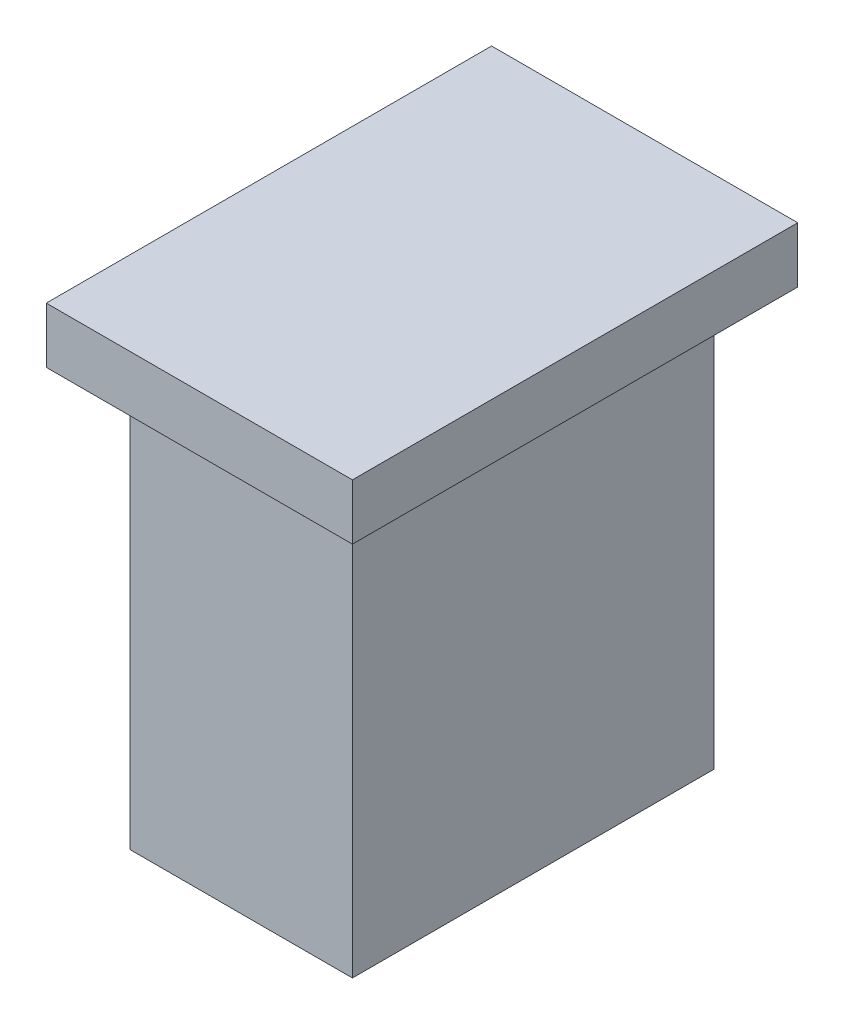
ISO-10303-21;
HEADER;
FILE_DESCRIPTION(('STEP AP214'),'2;1');
FILE_NAME('part.step','',(''),(''),'','','');
FILE_SCHEMA(('AUTOMOTIVE_DESIGN { 1 0 10303 214 1 1 1 1 }'));
ENDSEC;
DATA;
#1=APPLICATION_CONTEXT('core data for automotive mechanical design processes');
#2=APPLICATION_PROTOCOL_DEFINITION('international standard','automotive_design',2000,#1);
#3=PRODUCT_CONTEXT('',#1,'mechanical');
#4=PRODUCT('Part','Part','',(#3));
#5=PRODUCT_RELATED_PRODUCT_CATEGORY('part','',(#4));
#6=PRODUCT_DEFINITION_FORMATION('','',#4);
#7=PRODUCT_DEFINITION_CONTEXT('part definition',#1,'design');
#8=PRODUCT_DEFINITION('design','',#6,#7);
#9=PRODUCT_DEFINITION_SHAPE('','',#8);
#10=(LENGTH_UNIT() NAMED_UNIT(*) SI_UNIT(.MILLI.,.METRE.));
#11=(NAMED_UNIT(*) PLANE_ANGLE_UNIT() SI_UNIT($,.RADIAN.));
#12=(NAMED_UNIT(*) SI_UNIT($,.STERADIAN.) SOLID_ANGLE_UNIT());
#13=UNCERTAINTY_MEASURE_WITH_UNIT(LENGTH_MEASURE(1.E-05),#10,'distance_accuracy_value','');
#14=(GEOMETRIC_REPRESENTATION_CONTEXT(3) GLOBAL_UNCERTAINTY_ASSIGNED_CONTEXT((#13)) GLOBAL_UNIT_ASSIGNED_CONTEXT((#10,
#11,#12)) REPRESENTATION_CONTEXT('',''));
#15=CARTESIAN_POINT('',(0.,0.,0.));
#16=DIRECTION('',(0.,0.,1.));
#17=DIRECTION('',(1.,0.,0.));
#18=AXIS2_PLACEMENT_3D('',#15,#16,#17);
#19=CARTESIAN_POINT('',(4.,15.,-6.5));
#20=DIRECTION('',(-1.,0.,0.));
#21=DIRECTION('',(0.,0.,1.));
#22=AXIS2_PLACEMENT_3D('',#19,#20,#21);
#23=PLANE('',#22);
#24=DIRECTION('',(0.,0.,-1.));
#25=VECTOR('',#24,1.);
#26=CARTESIAN_POINT('',(4.,0.,-6.5));
#27=LINE('',#26,#25);
#28=CARTESIAN_POINT('',(4.,0.,6.5));
#29=VERTEX_POINT('',#28);
#30=CARTESIAN_POINT('',(4.,0.,-6.5));
#31=VERTEX_POINT('',#30);
#32=EDGE_CURVE('E147',#29,#31,#27,.T.);
#33=ORIENTED_EDGE('',*,*,#32,.T.);
#34=DIRECTION('',(0.,-1.,0.));
#35=VECTOR('',#34,1.);
#36=CARTESIAN_POINT('',(4.,15.,-6.5));
#37=LINE('',#36,#35);
#38=CARTESIAN_POINT('',(4.,15.,-6.5));
#39=VERTEX_POINT('',#38);
#40=EDGE_CURVE('E11',#39,#31,#37,.T.);
#41=ORIENTED_EDGE('',*,*,#40,.F.);
#42=DIRECTION('',(0.,0.,-1.));
#43=VECTOR('',#42,1.);
#44=CARTESIAN_POINT('',(4.,15.,-6.5));
#45=LINE('',#44,#43);
#46=CARTESIAN_POINT('',(4.,15.,6.5));
#47=VERTEX_POINT('',#46);
#48=EDGE_CURVE('E158',#47,#39,#45,.T.);
#49=ORIENTED_EDGE('',*,*,#48,.F.);
#50=DIRECTION('',(0.,-1.,0.));
#51=VECTOR('',#50,1.);
#52=CARTESIAN_POINT('',(4.,15.,6.5));
#53=LINE('',#52,#51);
#54=EDGE_CURVE('E171',#47,#29,#53,.T.);
#55=ORIENTED_EDGE('',*,*,#54,.T.);
#56=EDGE_LOOP('',(#33,#41,#49,#55));
#57=FACE_BOUND('',#56,.T.);
#58=ADVANCED_FACE('F45',(#57),#23,.F.);
#59=CARTESIAN_POINT('',(-4.,15.,-6.5));
#60=DIRECTION('',(0.,0.,1.));
#61=DIRECTION('',(1.,0.,0.));
#62=AXIS2_PLACEMENT_3D('',#59,#60,#61);
#63=PLANE('',#62);
#64=DIRECTION('',(-1.,0.,0.));
#65=VECTOR('',#64,1.);
#66=CARTESIAN_POINT('',(-4.,0.,-6.5));
#67=LINE('',#66,#65);
#68=CARTESIAN_POINT('',(-4.,0.,-6.5));
#69=VERTEX_POINT('',#68);
#70=EDGE_CURVE('E152',#31,#69,#67,.T.);
#71=ORIENTED_EDGE('',*,*,#70,.T.);
#72=DIRECTION('',(0.,-1.,0.));
#73=VECTOR('',#72,1.);
#74=CARTESIAN_POINT('',(-4.,15.,-6.5));
#75=LINE('',#74,#73);
#76=CARTESIAN_POINT('',(-4.,15.,-6.5));
#77=VERTEX_POINT('',#76);
#78=EDGE_CURVE('E54',#77,#69,#75,.T.);
#79=ORIENTED_EDGE('',*,*,#78,.F.);
#80=DIRECTION('',(-1.,0.,0.));
#81=VECTOR('',#80,1.);
#82=CARTESIAN_POINT('',(-4.,15.,-6.5));
#83=LINE('',#82,#81);
#84=EDGE_CURVE('E88',#39,#77,#83,.T.);
#85=ORIENTED_EDGE('',*,*,#84,.F.);
#86=ORIENTED_EDGE('',*,*,#40,.T.);
#87=EDGE_LOOP('',(#71,#79,#85,#86));
#88=FACE_BOUND('',#87,.T.);
#89=ADVANCED_FACE('F204',(#88),#63,.F.);
#90=CARTESIAN_POINT('',(-4.,15.,-6.5));
#91=DIRECTION('',(1.,0.,0.));
#92=DIRECTION('',(0.,0.,-1.));
#93=AXIS2_PLACEMENT_3D('',#90,#91,#92);
#94=PLANE('',#93);
#95=DIRECTION('',(0.,0.,1.));
#96=VECTOR('',#95,1.);
#97=CARTESIAN_POINT('',(-4.,0.,-6.5));
#98=LINE('',#97,#96);
#99=CARTESIAN_POINT('',(-4.,0.,6.5));
#100=VERTEX_POINT('',#99);
#101=EDGE_CURVE('E78',#69,#100,#98,.T.);
#102=ORIENTED_EDGE('',*,*,#101,.T.);
#103=DIRECTION('',(0.,-1.,0.));
#104=VECTOR('',#103,1.);
#105=CARTESIAN_POINT('',(-4.,15.,6.5));
#106=LINE('',#105,#104);
#107=CARTESIAN_POINT('',(-4.,15.,6.5));
#108=VERTEX_POINT('',#107);
#109=EDGE_CURVE('E62',#108,#100,#106,.T.);
#110=ORIENTED_EDGE('',*,*,#109,.F.);
#111=DIRECTION('',(0.,0.,1.));
#112=VECTOR('',#111,1.);
#113=CARTESIAN_POINT('',(-4.,15.,-6.5));
#114=LINE('',#113,#112);
#115=EDGE_CURVE('E164',#77,#108,#114,.T.);
#116=ORIENTED_EDGE('',*,*,#115,.F.);
#117=ORIENTED_EDGE('',*,*,#78,.T.);
#118=EDGE_LOOP('',(#102,#110,#116,#117));
#119=FACE_BOUND('',#118,.T.);
#120=ADVANCED_FACE('F183',(#119),#94,.F.);
#121=CARTESIAN_POINT('',(-4.,15.,6.5));
#122=DIRECTION('',(0.,0.,-1.));
#123=DIRECTION('',(-1.,0.,0.));
#124=AXIS2_PLACEMENT_3D('',#121,#122,#123);
#125=PLANE('',#124);
#126=DIRECTION('',(1.,0.,0.));
#127=VECTOR('',#126,1.);
#128=CARTESIAN_POINT('',(-4.,0.,6.5));
#129=LINE('',#128,#127);
#130=EDGE_CURVE('E83',#100,#29,#129,.T.);
#131=ORIENTED_EDGE('',*,*,#130,.T.);
#132=ORIENTED_EDGE('',*,*,#54,.F.);
#133=DIRECTION('',(1.,0.,0.));
#134=VECTOR('',#133,1.);
#135=CARTESIAN_POINT('',(-4.,15.,6.5));
#136=LINE('',#135,#134);
#137=EDGE_CURVE('E168',#108,#47,#136,.T.);
#138=ORIENTED_EDGE('',*,*,#137,.F.);
#139=ORIENTED_EDGE('',*,*,#109,.T.);
#140=EDGE_LOOP('',(#131,#132,#138,#139));
#141=FACE_BOUND('',#140,.T.);
#142=ADVANCED_FACE('F188',(#141),#125,.F.);
#143=CARTESIAN_POINT('',(0.,0.,0.));
#144=DIRECTION('',(0.,1.,0.));
#145=DIRECTION('',(0.,0.,1.));
#146=AXIS2_PLACEMENT_3D('',#143,#144,#145);
#147=PLANE('',#146);
#148=ORIENTED_EDGE('',*,*,#32,.F.);
#149=ORIENTED_EDGE('',*,*,#130,.F.);
#150=ORIENTED_EDGE('',*,*,#101,.F.);
#151=ORIENTED_EDGE('',*,*,#70,.F.);
#152=EDGE_LOOP('',(#148,#149,#150,#151));
#153=FACE_BOUND('',#152,.T.);
#154=ADVANCED_FACE('F186',(#153),#147,.F.);
#155=CARTESIAN_POINT('',(0.,15.,0.));
#156=DIRECTION('',(0.,1.,0.));
#157=DIRECTION('',(0.,0.,1.));
#158=AXIS2_PLACEMENT_3D('',#155,#156,#157);
#159=PLANE('',#158);
#160=DIRECTION('',(0.,0.,-1.));
#161=VECTOR('',#160,1.);
#162=CARTESIAN_POINT('',(5.5,15.,-8.));
#163=LINE('',#162,#161);
#164=CARTESIAN_POINT('',(5.5,15.,8.));
#165=VERTEX_POINT('',#164);
#166=CARTESIAN_POINT('',(5.5,15.,-8.));
#167=VERTEX_POINT('',#166);
#168=EDGE_CURVE('E145',#165,#167,#163,.T.);
#169=ORIENTED_EDGE('',*,*,#168,.F.);
#170=DIRECTION('',(1.,0.,0.));
#171=VECTOR('',#170,1.);
#172=CARTESIAN_POINT('',(-5.5,15.,8.));
#173=LINE('',#172,#171);
#174=CARTESIAN_POINT('',(-5.5,15.,8.));
#175=VERTEX_POINT('',#174);
#176=EDGE_CURVE('E141',#175,#165,#173,.T.);
#177=ORIENTED_EDGE('',*,*,#176,.F.);
#178=DIRECTION('',(0.,0.,1.));
#179=VECTOR('',#178,1.);
#180=CARTESIAN_POINT('',(-5.5,15.,-8.));
#181=LINE('',#180,#179);
#182=CARTESIAN_POINT('',(-5.5,15.,-8.));
#183=VERTEX_POINT('',#182);
#184=EDGE_CURVE('E231',#183,#175,#181,.T.);
#185=ORIENTED_EDGE('',*,*,#184,.F.);
#186=DIRECTION('',(-1.,0.,0.));
#187=VECTOR('',#186,1.);
#188=CARTESIAN_POINT('',(-5.5,15.,-8.));
#189=LINE('',#188,#187);
#190=EDGE_CURVE('E235',#167,#183,#189,.T.);
#191=ORIENTED_EDGE('',*,*,#190,.F.);
#192=EDGE_LOOP('',(#169,#177,#185,#191));
#193=FACE_BOUND('',#192,.T.);
#194=ORIENTED_EDGE('',*,*,#137,.T.);
#195=ORIENTED_EDGE('',*,*,#48,.T.);
#196=ORIENTED_EDGE('',*,*,#84,.T.);
#197=ORIENTED_EDGE('',*,*,#115,.T.);
#198=EDGE_LOOP('',(#194,#195,#196,#197));
#199=FACE_BOUND('',#198,.T.);
#200=ADVANCED_FACE('F190',(#193,#199),#159,.F.);
#201=CARTESIAN_POINT('',(5.5,17.,-8.));
#202=DIRECTION('',(-1.,0.,0.));
#203=DIRECTION('',(0.,0.,1.));
#204=AXIS2_PLACEMENT_3D('',#201,#202,#203);
#205=PLANE('',#204);
#206=ORIENTED_EDGE('',*,*,#168,.T.);
#207=DIRECTION('',(0.,-1.,0.));
#208=VECTOR('',#207,1.);
#209=CARTESIAN_POINT('',(5.5,17.,-8.));
#210=LINE('',#209,#208);
#211=CARTESIAN_POINT('',(5.5,17.,-8.));
#212=VERTEX_POINT('',#211);
#213=EDGE_CURVE('E123',#212,#167,#210,.T.);
#214=ORIENTED_EDGE('',*,*,#213,.F.);
#215=DIRECTION('',(0.,0.,-1.));
#216=VECTOR('',#215,1.);
#217=CARTESIAN_POINT('',(5.5,17.,-8.));
#218=LINE('',#217,#216);
#219=CARTESIAN_POINT('',(5.5,17.,8.));
#220=VERTEX_POINT('',#219);
#221=EDGE_CURVE('E131',#220,#212,#218,.T.);
#222=ORIENTED_EDGE('',*,*,#221,.F.);
#223=DIRECTION('',(0.,-1.,0.));
#224=VECTOR('',#223,1.);
#225=CARTESIAN_POINT('',(5.5,17.,8.));
#226=LINE('',#225,#224);
#227=EDGE_CURVE('E227',#220,#165,#226,.T.);
#228=ORIENTED_EDGE('',*,*,#227,.T.);
#229=EDGE_LOOP('',(#206,#214,#222,#228));
#230=FACE_BOUND('',#229,.T.);
#231=ADVANCED_FACE('F143',(#230),#205,.F.);
#232=CARTESIAN_POINT('',(-5.5,17.,-8.));
#233=DIRECTION('',(0.,0.,1.));
#234=DIRECTION('',(1.,0.,0.));
#235=AXIS2_PLACEMENT_3D('',#232,#233,#234);
#236=PLANE('',#235);
#237=ORIENTED_EDGE('',*,*,#190,.T.);
#238=DIRECTION('',(0.,-1.,0.));
#239=VECTOR('',#238,1.);
#240=CARTESIAN_POINT('',(-5.5,17.,-8.));
#241=LINE('',#240,#239);
#242=CARTESIAN_POINT('',(-5.5,17.,-8.));
#243=VERTEX_POINT('',#242);
#244=EDGE_CURVE('E126',#243,#183,#241,.T.);
#245=ORIENTED_EDGE('',*,*,#244,.F.);
#246=DIRECTION('',(-1.,0.,0.));
#247=VECTOR('',#246,1.);
#248=CARTESIAN_POINT('',(-5.5,17.,-8.));
#249=LINE('',#248,#247);
#250=EDGE_CURVE('E119',#212,#243,#249,.T.);
#251=ORIENTED_EDGE('',*,*,#250,.F.);
#252=ORIENTED_EDGE('',*,*,#213,.T.);
#253=EDGE_LOOP('',(#237,#245,#251,#252));
#254=FACE_BOUND('',#253,.T.);
#255=ADVANCED_FACE('F121',(#254),#236,.F.);
#256=CARTESIAN_POINT('',(-5.5,17.,-8.));
#257=DIRECTION('',(1.,0.,0.));
#258=DIRECTION('',(0.,0.,-1.));
#259=AXIS2_PLACEMENT_3D('',#256,#257,#258);
#260=PLANE('',#259);
#261=ORIENTED_EDGE('',*,*,#184,.T.);
#262=DIRECTION('',(0.,-1.,0.));
#263=VECTOR('',#262,1.);
#264=CARTESIAN_POINT('',(-5.5,17.,8.));
#265=LINE('',#264,#263);
#266=CARTESIAN_POINT('',(-5.5,17.,8.));
#267=VERTEX_POINT('',#266);
#268=EDGE_CURVE('E154',#267,#175,#265,.T.);
#269=ORIENTED_EDGE('',*,*,#268,.F.);
#270=DIRECTION('',(0.,0.,1.));
#271=VECTOR('',#270,1.);
#272=CARTESIAN_POINT('',(-5.5,17.,-8.));
#273=LINE('',#272,#271);
#274=EDGE_CURVE('E130',#243,#267,#273,.T.);
#275=ORIENTED_EDGE('',*,*,#274,.F.);
#276=ORIENTED_EDGE('',*,*,#244,.T.);
#277=EDGE_LOOP('',(#261,#269,#275,#276));
#278=FACE_BOUND('',#277,.T.);
#279=ADVANCED_FACE('F216',(#278),#260,.F.);
#280=CARTESIAN_POINT('',(-5.5,17.,8.));
#281=DIRECTION('',(0.,0.,-1.));
#282=DIRECTION('',(-1.,0.,0.));
#283=AXIS2_PLACEMENT_3D('',#280,#281,#282);
#284=PLANE('',#283);
#285=ORIENTED_EDGE('',*,*,#176,.T.);
#286=ORIENTED_EDGE('',*,*,#227,.F.);
#287=DIRECTION('',(1.,0.,0.));
#288=VECTOR('',#287,1.);
#289=CARTESIAN_POINT('',(-5.5,17.,8.));
#290=LINE('',#289,#288);
#291=EDGE_CURVE('E136',#267,#220,#290,.T.);
#292=ORIENTED_EDGE('',*,*,#291,.F.);
#293=ORIENTED_EDGE('',*,*,#268,.T.);
#294=EDGE_LOOP('',(#285,#286,#292,#293));
#295=FACE_BOUND('',#294,.T.);
#296=ADVANCED_FACE('F218',(#295),#284,.F.);
#297=CARTESIAN_POINT('',(0.,17.,0.));
#298=DIRECTION('',(0.,1.,0.));
#299=DIRECTION('',(0.,0.,1.));
#300=AXIS2_PLACEMENT_3D('',#297,#298,#299);
#301=PLANE('',#300);
#302=ORIENTED_EDGE('',*,*,#221,.T.);
#303=ORIENTED_EDGE('',*,*,#250,.T.);
#304=ORIENTED_EDGE('',*,*,#274,.T.);
#305=ORIENTED_EDGE('',*,*,#291,.T.);
#306=EDGE_LOOP('',(#302,#303,#304,#305));
#307=FACE_BOUND('',#306,.T.);
#308=ADVANCED_FACE('F134',(#307),#301,.T.);
#309=CLOSED_SHELL('',(#58,#89,#120,#142,#154,#200,#231,#255,#279,#296,#308));
#310=MANIFOLD_SOLID_BREP('B2',#309);
#311=ADVANCED_BREP_SHAPE_REPRESENTATION('',(#18,#310),#14);
#312=SHAPE_DEFINITION_REPRESENTATION(#9,#311);
ENDSEC;
END-ISO-10303-21;
